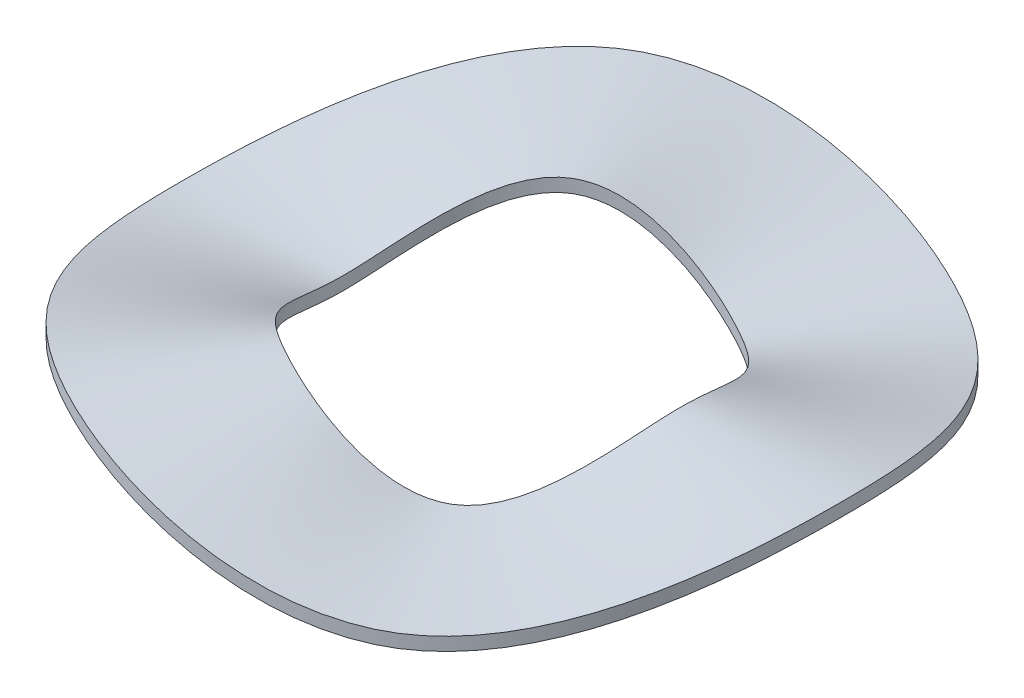
ISO-10303-21;
HEADER;
FILE_DESCRIPTION(('STEP AP214'),'2;1');
FILE_NAME('part.step','',(''),(''),'','','');
FILE_SCHEMA(('AUTOMOTIVE_DESIGN { 1 0 10303 214 1 1 1 1 }'));
ENDSEC;
DATA;
#1=APPLICATION_CONTEXT('core data for automotive mechanical design processes');
#2=APPLICATION_PROTOCOL_DEFINITION('international standard','automotive_design',2000,#1);
#3=PRODUCT_CONTEXT('',#1,'mechanical');
#4=PRODUCT('Part','Part','',(#3));
#5=PRODUCT_RELATED_PRODUCT_CATEGORY('part','',(#4));
#6=PRODUCT_DEFINITION_FORMATION('','',#4);
#7=PRODUCT_DEFINITION_CONTEXT('part definition',#1,'design');
#8=PRODUCT_DEFINITION('design','',#6,#7);
#9=PRODUCT_DEFINITION_SHAPE('','',#8);
#10=(LENGTH_UNIT() NAMED_UNIT(*) SI_UNIT(.MILLI.,.METRE.));
#11=(NAMED_UNIT(*) PLANE_ANGLE_UNIT() SI_UNIT($,.RADIAN.));
#12=(NAMED_UNIT(*) SI_UNIT($,.STERADIAN.) SOLID_ANGLE_UNIT());
#13=UNCERTAINTY_MEASURE_WITH_UNIT(LENGTH_MEASURE(1.E-05),#10,'distance_accuracy_value','');
#14=(GEOMETRIC_REPRESENTATION_CONTEXT(3) GLOBAL_UNCERTAINTY_ASSIGNED_CONTEXT((#13)) GLOBAL_UNIT_ASSIGNED_CONTEXT((#10,
#11,#12)) REPRESENTATION_CONTEXT('',''));
#15=CARTESIAN_POINT('',(0.,0.,0.));
#16=DIRECTION('',(0.,0.,1.));
#17=DIRECTION('',(1.,0.,0.));
#18=AXIS2_PLACEMENT_3D('',#15,#16,#17);
#19=CARTESIAN_POINT('',(-3.175,0.127,0.));
#20=CARTESIAN_POINT('',(-3.17500000000024,0.126999999999933,-0.0549926131404743));
#21=CARTESIAN_POINT('',(-3.17182500000067,0.129539999999809,-0.164977839421388));
#22=CARTESIAN_POINT('',(-3.15777562500116,0.140207999999649,-0.329543234244113));
#23=CARTESIAN_POINT('',(-3.13467750000151,0.156971999999514,-0.493283739869645));
#24=CARTESIAN_POINT('',(-2.94322500000291,0.289559999998846,-1.46830277084843));
#25=CARTESIAN_POINT('',(-1.65099999999217,1.0414000000012,-3.29955678841877));
#26=CARTESIAN_POINT('',(1.90499999998702,-0.380999999999987,-3.29955678842627));
#27=CARTESIAN_POINT('',(3.81000000000498,1.14299999999874,8.16995126065589E-12));
#28=CARTESIAN_POINT('',(1.90499999998431,-0.381000000001981,3.29955678842067));
#29=CARTESIAN_POINT('',(-1.65099999997634,1.04139999999984,3.2995567884332));
#30=CARTESIAN_POINT('',(-2.94322499999177,0.289560000001101,1.46830277084478));
#31=CARTESIAN_POINT('',(-3.13467749999722,0.156972000000686,0.493283739870457));
#32=CARTESIAN_POINT('',(-3.15777562499828,0.140208000000441,0.329543234244472));
#33=CARTESIAN_POINT('',(-3.17182499999923,0.129540000000208,0.164977839421458));
#34=CARTESIAN_POINT('',(-3.17499999999976,0.127000000000066,0.0549926131404746));
#35=CARTESIAN_POINT('',(-3.175,0.127,0.));
#36=CARTESIAN_POINT('',(-2.6543,0.127,0.));
#37=CARTESIAN_POINT('',(-2.6543000000002,0.126999999999933,-0.0459738245854365));
#38=CARTESIAN_POINT('',(-2.65164570000056,0.129539999999809,-0.137921473756281));
#39=CARTESIAN_POINT('',(-2.63990042250097,0.140207999999649,-0.275498143828078));
#40=CARTESIAN_POINT('',(-2.62059039000126,0.156971999999514,-0.412385206531023));
#41=CARTESIAN_POINT('',(-2.46053610000243,0.289559999998846,-1.22750111642929));
#42=CARTESIAN_POINT('',(-1.38023599999345,1.0414000000012,-2.7584294751181));
#43=CARTESIAN_POINT('',(1.59257999998915,-0.380999999999987,-2.75842947512436));
#44=CARTESIAN_POINT('',(3.18516000000417,1.14299999999874,6.82994852623138E-12));
#45=CARTESIAN_POINT('',(1.59257999998688,-0.381000000001981,2.75842947511968));
#46=CARTESIAN_POINT('',(-1.38023599998022,1.04139999999984,2.75842947513016));
#47=CARTESIAN_POINT('',(-2.46053609999312,0.289560000001101,1.22750111642624));
#48=CARTESIAN_POINT('',(-2.62059038999767,0.156972000000686,0.412385206531703));
#49=CARTESIAN_POINT('',(-2.63990042249856,0.140208000000441,0.275498143828379));
#50=CARTESIAN_POINT('',(-2.65164569999935,0.129540000000208,0.137921473756339));
#51=CARTESIAN_POINT('',(-2.6542999999998,0.127000000000066,0.0459738245854368));
#52=CARTESIAN_POINT('',(-2.6543,0.127,0.));
#53=CARTESIAN_POINT('',(-2.1336,0.127,0.));
#54=CARTESIAN_POINT('',(-2.13360000000016,0.126999999999933,-0.0369550360303987));
#55=CARTESIAN_POINT('',(-2.13146640000045,0.129539999999809,-0.110865108091173));
#56=CARTESIAN_POINT('',(-2.12202522000078,0.140207999999649,-0.221453053412044));
#57=CARTESIAN_POINT('',(-2.10650328000101,0.156971999999514,-0.331486673192401));
#58=CARTESIAN_POINT('',(-1.97784720000196,0.289559999998846,-0.986699462010148));
#59=CARTESIAN_POINT('',(-1.10947199999474,1.0414000000012,-2.21730216181742));
#60=CARTESIAN_POINT('',(1.28015999999128,-0.380999999999987,-2.21730216182246));
#61=CARTESIAN_POINT('',(2.56032000000335,1.14299999999874,5.49002371883801E-12));
#62=CARTESIAN_POINT('',(1.28015999998945,-0.381000000001981,2.21730216181869));
#63=CARTESIAN_POINT('',(-1.1094719999841,1.04139999999984,2.21730216182711));
#64=CARTESIAN_POINT('',(-1.97784719999447,0.289560000001101,0.986699462007693));
#65=CARTESIAN_POINT('',(-2.10650327999813,0.156972000000686,0.331486673192947));
#66=CARTESIAN_POINT('',(-2.12202521999885,0.140208000000441,0.221453053412285));
#67=CARTESIAN_POINT('',(-2.13146639999948,0.129540000000208,0.11086510809122));
#68=CARTESIAN_POINT('',(-2.13359999999984,0.127000000000066,0.036955036030399));
#69=CARTESIAN_POINT('',(-2.1336,0.127,0.));
#70=CARTESIAN_POINT('',(-1.6129,0.127,0.));
#71=CARTESIAN_POINT('',(-1.61290000000012,0.126999999999933,-0.027936247475361));
#72=CARTESIAN_POINT('',(-1.61128710000034,0.129539999999809,-0.0838087424260653));
#73=CARTESIAN_POINT('',(-1.60415001750059,0.140207999999649,-0.167407962996009));
#74=CARTESIAN_POINT('',(-1.59241617000077,0.156971999999514,-0.250588139853779));
#75=CARTESIAN_POINT('',(-1.49515830000148,0.289559999998846,-0.745897807591005));
#76=CARTESIAN_POINT('',(-0.838707999996021,1.0414000000012,-1.67617484851674));
#77=CARTESIAN_POINT('',(0.967739999993405,-0.380999999999987,-1.67617484852055));
#78=CARTESIAN_POINT('',(1.93548000000253,1.14299999999874,4.15046821780965E-12));
#79=CARTESIAN_POINT('',(0.967739999992027,-0.381000000001981,1.6761748485177));
#80=CARTESIAN_POINT('',(-0.838707999987978,1.04139999999984,1.67617484852407));
#81=CARTESIAN_POINT('',(-1.49515829999582,0.289560000001101,0.745897807589149));
#82=CARTESIAN_POINT('',(-1.59241616999859,0.156972000000686,0.250588139854192));
#83=CARTESIAN_POINT('',(-1.60415001749913,0.140208000000441,0.167407962996192));
#84=CARTESIAN_POINT('',(-1.61128709999961,0.129540000000208,0.0838087424261007));
#85=CARTESIAN_POINT('',(-1.61289999999988,0.127000000000066,0.0279362474753611));
#86=CARTESIAN_POINT('',(-1.6129,0.127,0.));
#87=B_SPLINE_SURFACE_WITH_KNOTS('',3,3,((#19,#20,#21,#22,#23,#24,#25,#26,#27,#28,#29,#30,#31,
#32,#33,#34,#35),(#36,#37,#38,#39,#40,#41,#42,#43,#44,#45,#46,#47,#48,#49,#50,#51,#52),(#53,#54,
#55,#56,#57,#58,#59,#60,#61,#62,#63,#64,#65,#66,#67,#68,#69),(#70,#71,#72,#73,#74,#75,#76,#77,
#78,#79,#80,#81,#82,#83,#84,#85,#86)),.UNSPECIFIED.,.F.,.T.,.F.,(4,4),(4,1,1,1,1,1,1,1,1,1,1,1,
1,1,4),(0.,1.),(0.,0.0083333333333333,0.0166666666666666,0.0250000000000001,0.0333333333333334,
0.16666666666667,0.333333333333885,0.5,0.666666666666687,0.833333333334569,0.966666666666667,
0.975,0.983333333333333,0.991666666666667,1.),.UNSPECIFIED.);
#88=CARTESIAN_POINT('',(-3.175,0.127,0.));
#89=CARTESIAN_POINT('',(-3.17500000000024,0.126999999999933,-0.0549926131404743));
#90=CARTESIAN_POINT('',(-3.17182500000067,0.129539999999809,-0.164977839421388));
#91=CARTESIAN_POINT('',(-3.15777562500116,0.140207999999649,-0.329543234244113));
#92=CARTESIAN_POINT('',(-3.13467750000151,0.156971999999514,-0.493283739869645));
#93=CARTESIAN_POINT('',(-2.94322500000291,0.289559999998846,-1.46830277084843));
#94=CARTESIAN_POINT('',(-1.65099999999217,1.0414000000012,-3.29955678841877));
#95=CARTESIAN_POINT('',(1.90499999998702,-0.380999999999987,-3.29955678842627));
#96=CARTESIAN_POINT('',(3.81000000000498,1.14299999999874,8.16995126065589E-12));
#97=CARTESIAN_POINT('',(1.90499999998431,-0.381000000001981,3.29955678842067));
#98=CARTESIAN_POINT('',(-1.65099999997634,1.04139999999984,3.2995567884332));
#99=CARTESIAN_POINT('',(-2.94322499999177,0.289560000001101,1.46830277084478));
#100=CARTESIAN_POINT('',(-3.13467749999722,0.156972000000686,0.493283739870457));
#101=CARTESIAN_POINT('',(-3.15777562499828,0.140208000000441,0.329543234244472));
#102=CARTESIAN_POINT('',(-3.17182499999923,0.129540000000208,0.164977839421458));
#103=CARTESIAN_POINT('',(-3.17499999999976,0.127000000000066,0.0549926131404746));
#104=CARTESIAN_POINT('',(-3.175,0.127,0.));
#105=B_SPLINE_CURVE_WITH_KNOTS('',3,(#88,#89,#90,#91,#92,#93,#94,#95,#96,#97,#98,#99,#100,#101,
#102,#103,#104),.UNSPECIFIED.,.T.,.F.,(4,1,1,1,1,1,1,1,1,1,1,1,1,1,4),(0.,0.0083333333333333,
0.0166666666666666,0.0250000000000001,0.0333333333333334,0.16666666666667,0.333333333333885,0.5,
0.666666666666687,0.833333333334569,0.966666666666667,0.975,0.983333333333333,0.991666666666667,
1.),.UNSPECIFIED.);
#106=CARTESIAN_POINT('',(-3.175,0.127,0.));
#107=VERTEX_POINT('',#106);
#108=EDGE_CURVE('E11',#107,#107,#105,.F.);
#109=CARTESIAN_POINT('',(-1.6129,0.127,0.));
#110=CARTESIAN_POINT('',(-1.61290000000012,0.126999999999933,-0.027936247475361));
#111=CARTESIAN_POINT('',(-1.61128710000034,0.129539999999809,-0.0838087424260653));
#112=CARTESIAN_POINT('',(-1.60415001750059,0.140207999999649,-0.167407962996009));
#113=CARTESIAN_POINT('',(-1.59241617000077,0.156971999999514,-0.250588139853779));
#114=CARTESIAN_POINT('',(-1.49515830000148,0.289559999998846,-0.745897807591005));
#115=CARTESIAN_POINT('',(-0.838707999996021,1.0414000000012,-1.67617484851674));
#116=CARTESIAN_POINT('',(0.967739999993405,-0.380999999999987,-1.67617484852055));
#117=CARTESIAN_POINT('',(1.93548000000253,1.14299999999874,4.15046821780965E-12));
#118=CARTESIAN_POINT('',(0.967739999992027,-0.381000000001981,1.6761748485177));
#119=CARTESIAN_POINT('',(-0.838707999987978,1.04139999999984,1.67617484852407));
#120=CARTESIAN_POINT('',(-1.49515829999582,0.289560000001101,0.745897807589149));
#121=CARTESIAN_POINT('',(-1.59241616999859,0.156972000000686,0.250588139854192));
#122=CARTESIAN_POINT('',(-1.60415001749913,0.140208000000441,0.167407962996192));
#123=CARTESIAN_POINT('',(-1.61128709999961,0.129540000000208,0.0838087424261007));
#124=CARTESIAN_POINT('',(-1.61289999999988,0.127000000000066,0.0279362474753611));
#125=CARTESIAN_POINT('',(-1.6129,0.127,0.));
#126=B_SPLINE_CURVE_WITH_KNOTS('',3,(#109,#110,#111,#112,#113,#114,#115,#116,#117,#118,#119,
#120,#121,#122,#123,#124,#125),.UNSPECIFIED.,.T.,.F.,(4,1,1,1,1,1,1,1,1,1,1,1,1,1,4),(0.,
0.0083333333333333,0.0166666666666666,0.0250000000000001,0.0333333333333334,0.16666666666667,
0.333333333333885,0.5,0.666666666666687,0.833333333334569,0.966666666666667,0.975,
0.983333333333333,0.991666666666667,1.),.UNSPECIFIED.);
#127=CARTESIAN_POINT('',(-1.6129,0.127,0.));
#128=VERTEX_POINT('',#127);
#129=EDGE_CURVE('E58',#128,#128,#126,.T.);
#130=ORIENTED_EDGE('',*,*,#108,.T.);
#131=EDGE_LOOP('',(#130));
#132=FACE_BOUND('',#131,.T.);
#133=ORIENTED_EDGE('',*,*,#129,.T.);
#134=EDGE_LOOP('',(#133));
#135=FACE_BOUND('',#134,.T.);
#136=ADVANCED_FACE('F46',(#132,#135),#87,.T.);
#137=CARTESIAN_POINT('',(-3.175,0.,0.));
#138=CARTESIAN_POINT('',(-3.17500000000024,0.,-0.0549926131404742));
#139=CARTESIAN_POINT('',(-3.17182500000067,0.00253999999980946,-0.164977839421388));
#140=CARTESIAN_POINT('',(-3.15777562500116,0.0132079999996492,-0.329543234244113));
#141=CARTESIAN_POINT('',(-3.13467750000151,0.0299719999995138,-0.493283739869645));
#142=CARTESIAN_POINT('',(-2.94322500000291,0.162559999998846,-1.46830277084843));
#143=CARTESIAN_POINT('',(-1.65099999999217,0.914400000001202,-3.29955678841877));
#144=CARTESIAN_POINT('',(1.90499999998702,-0.507999999999987,-3.29955678842627));
#145=CARTESIAN_POINT('',(3.81000000000498,1.01599999999874,8.16959889494984E-12));
#146=CARTESIAN_POINT('',(1.90499999998431,-0.508000000001981,3.29955678842067));
#147=CARTESIAN_POINT('',(-1.65099999997634,0.91439999999984,3.2995567884332));
#148=CARTESIAN_POINT('',(-2.94322499999177,0.162560000001101,1.46830277084478));
#149=CARTESIAN_POINT('',(-3.13467749999722,0.0299720000006862,0.493283739870458));
#150=CARTESIAN_POINT('',(-3.15777562499828,0.0132080000004409,0.329543234244472));
#151=CARTESIAN_POINT('',(-3.17182499999923,0.00254000000020836,0.164977839421458));
#152=CARTESIAN_POINT('',(-3.17499999999976,0.,0.0549926131404747));
#153=CARTESIAN_POINT('',(-3.175,0.,0.));
#154=CARTESIAN_POINT('',(-3.175,0.0105833333333332,0.));
#155=CARTESIAN_POINT('',(-3.17500000000024,0.0105833333332667,-0.0549926131404743));
#156=CARTESIAN_POINT('',(-3.17182500000067,0.0131233333331427,-0.164977839421388));
#157=CARTESIAN_POINT('',(-3.15777562500116,0.0237913333329824,-0.329543234244113));
#158=CARTESIAN_POINT('',(-3.13467750000151,0.040555333332847,-0.493283739869645));
#159=CARTESIAN_POINT('',(-2.94322500000291,0.173143333332179,-1.46830277084843));
#160=CARTESIAN_POINT('',(-1.65099999999217,0.924983333334535,-3.29955678841877));
#161=CARTESIAN_POINT('',(1.90499999998702,-0.497416666666654,-3.29955678842627));
#162=CARTESIAN_POINT('',(3.81000000000498,1.02658333333208,8.16995126065589E-12));
#163=CARTESIAN_POINT('',(1.90499999998431,-0.497416666668648,3.29955678842067));
#164=CARTESIAN_POINT('',(-1.65099999997634,0.924983333333173,3.2995567884332));
#165=CARTESIAN_POINT('',(-2.94322499999177,0.173143333334434,1.46830277084478));
#166=CARTESIAN_POINT('',(-3.13467749999722,0.0405553333340195,0.493283739870457));
#167=CARTESIAN_POINT('',(-3.15777562499828,0.0237913333337742,0.329543234244472));
#168=CARTESIAN_POINT('',(-3.17182499999923,0.0131233333335416,0.164977839421458));
#169=CARTESIAN_POINT('',(-3.17499999999976,0.0105833333333997,0.0549926131404746));
#170=CARTESIAN_POINT('',(-3.175,0.0105833333333332,0.));
#171=CARTESIAN_POINT('',(-3.17500000000001,0.0317500000000001,0.));
#172=CARTESIAN_POINT('',(-3.17500000000025,0.0317499999999336,-0.0549926131404742));
#173=CARTESIAN_POINT('',(-3.17182500000067,0.0342899999998095,-0.164977839421388));
#174=CARTESIAN_POINT('',(-3.15777562500116,0.0449579999996493,-0.329543234244113));
#175=CARTESIAN_POINT('',(-3.13467750000152,0.0617219999995139,-0.493283739869645));
#176=CARTESIAN_POINT('',(-2.94322500000291,0.194309999998846,-1.46830277084844));
#177=CARTESIAN_POINT('',(-1.65099999999217,0.946150000001203,-3.29955678841878));
#178=CARTESIAN_POINT('',(1.90499999998702,-0.476249999999988,-3.29955678842627));
#179=CARTESIAN_POINT('',(3.81000000000499,1.04774999999875,8.1674203262095E-12));
#180=CARTESIAN_POINT('',(1.9049999999843,-0.476250000001982,3.29955678842067));
#181=CARTESIAN_POINT('',(-1.65099999997633,0.946149999999841,3.2995567884332));
#182=CARTESIAN_POINT('',(-2.94322499999177,0.194310000001102,1.46830277084478));
#183=CARTESIAN_POINT('',(-3.13467749999722,0.0617220000006865,0.493283739870458));
#184=CARTESIAN_POINT('',(-3.15777562499829,0.0449580000004411,0.329543234244472));
#185=CARTESIAN_POINT('',(-3.17182499999923,0.0342900000002085,0.164977839421458));
#186=CARTESIAN_POINT('',(-3.17499999999977,0.0317500000000666,0.0549926131404747));
#187=CARTESIAN_POINT('',(-3.17500000000001,0.0317500000000001,0.));
#188=CARTESIAN_POINT('',(-3.175,0.0634999999999998,0.));
#189=CARTESIAN_POINT('',(-3.17500000000024,0.0634999999999333,-0.0549926131404742));
#190=CARTESIAN_POINT('',(-3.17182500000066,0.0660399999998093,-0.164977839421388));
#191=CARTESIAN_POINT('',(-3.15777562500115,0.076707999999649,-0.329543234244113));
#192=CARTESIAN_POINT('',(-3.13467750000151,0.0934719999995136,-0.493283739869644));
#193=CARTESIAN_POINT('',(-2.94322500000291,0.226059999998846,-1.46830277084843));
#194=CARTESIAN_POINT('',(-1.65099999999217,0.977900000001199,-3.29955678841877));
#195=CARTESIAN_POINT('',(1.90499999998702,-0.444499999999986,-3.29955678842628));
#196=CARTESIAN_POINT('',(3.81000000000498,1.07949999999874,8.17212982939623E-12));
#197=CARTESIAN_POINT('',(1.90499999998431,-0.44450000000198,3.29955678842066));
#198=CARTESIAN_POINT('',(-1.65099999997634,0.977899999999836,3.2995567884332));
#199=CARTESIAN_POINT('',(-2.94322499999177,0.2260600000011,1.46830277084478));
#200=CARTESIAN_POINT('',(-3.13467749999721,0.0934720000006859,0.493283739870458));
#201=CARTESIAN_POINT('',(-3.15777562499828,0.0767080000004407,0.329543234244472));
#202=CARTESIAN_POINT('',(-3.17182499999922,0.0660400000002082,0.164977839421458));
#203=CARTESIAN_POINT('',(-3.17499999999976,0.0635000000000663,0.0549926131404746));
#204=CARTESIAN_POINT('',(-3.175,0.0634999999999998,0.));
#205=CARTESIAN_POINT('',(-3.175,0.0952500000000001,0.));
#206=CARTESIAN_POINT('',(-3.17500000000024,0.0952499999999336,-0.0549926131404742));
#207=CARTESIAN_POINT('',(-3.17182500000067,0.0977899999998095,-0.164977839421388));
#208=CARTESIAN_POINT('',(-3.15777562500116,0.108457999999649,-0.329543234244113));
#209=CARTESIAN_POINT('',(-3.13467750000151,0.125221999999514,-0.493283739869645));
#210=CARTESIAN_POINT('',(-2.94322500000291,0.257809999998846,-1.46830277084844));
#211=CARTESIAN_POINT('',(-1.65099999999217,1.0096500000012,-3.29955678841878));
#212=CARTESIAN_POINT('',(1.90499999998702,-0.412749999999987,-3.29955678842627));
#213=CARTESIAN_POINT('',(3.81000000000499,1.11124999999875,8.16777608004735E-12));
#214=CARTESIAN_POINT('',(1.90499999998431,-0.412750000001982,3.29955678842067));
#215=CARTESIAN_POINT('',(-1.65099999997633,1.00964999999984,3.2995567884332));
#216=CARTESIAN_POINT('',(-2.94322499999177,0.257810000001102,1.46830277084478));
#217=CARTESIAN_POINT('',(-3.13467749999722,0.125222000000686,0.493283739870458));
#218=CARTESIAN_POINT('',(-3.15777562499829,0.108458000000441,0.329543234244472));
#219=CARTESIAN_POINT('',(-3.17182499999923,0.0977900000002085,0.164977839421458));
#220=CARTESIAN_POINT('',(-3.17499999999976,0.0952500000000666,0.0549926131404747));
#221=CARTESIAN_POINT('',(-3.175,0.0952500000000001,0.));
#222=CARTESIAN_POINT('',(-3.175,0.116416666666667,0.));
#223=CARTESIAN_POINT('',(-3.17500000000024,0.1164166666666,-0.0549926131404743));
#224=CARTESIAN_POINT('',(-3.17182500000067,0.118956666666476,-0.164977839421388));
#225=CARTESIAN_POINT('',(-3.15777562500116,0.129624666666316,-0.329543234244113));
#226=CARTESIAN_POINT('',(-3.13467750000151,0.14638866666618,-0.493283739869645));
#227=CARTESIAN_POINT('',(-2.94322500000291,0.278976666665513,-1.46830277084843));
#228=CARTESIAN_POINT('',(-1.65099999999217,1.03081666666787,-3.29955678841877));
#229=CARTESIAN_POINT('',(1.90499999998702,-0.39158333333332,-3.29955678842627));
#230=CARTESIAN_POINT('',(3.81000000000498,1.13241666666541,8.16995126065589E-12));
#231=CARTESIAN_POINT('',(1.90499999998431,-0.391583333335315,3.29955678842067));
#232=CARTESIAN_POINT('',(-1.65099999997634,1.03081666666651,3.2995567884332));
#233=CARTESIAN_POINT('',(-2.94322499999177,0.278976666667768,1.46830277084478));
#234=CARTESIAN_POINT('',(-3.13467749999722,0.146388666667353,0.493283739870457));
#235=CARTESIAN_POINT('',(-3.15777562499828,0.129624666667107,0.329543234244472));
#236=CARTESIAN_POINT('',(-3.17182499999923,0.118956666666875,0.164977839421458));
#237=CARTESIAN_POINT('',(-3.17499999999976,0.116416666666733,0.0549926131404746));
#238=CARTESIAN_POINT('',(-3.175,0.116416666666667,0.));
#239=CARTESIAN_POINT('',(-3.175,0.127,0.));
#240=CARTESIAN_POINT('',(-3.17500000000024,0.126999999999933,-0.0549926131404742));
#241=CARTESIAN_POINT('',(-3.17182500000067,0.129539999999809,-0.164977839421388));
#242=CARTESIAN_POINT('',(-3.15777562500116,0.140207999999649,-0.329543234244113));
#243=CARTESIAN_POINT('',(-3.13467750000151,0.156971999999514,-0.493283739869645));
#244=CARTESIAN_POINT('',(-2.94322500000291,0.289559999998846,-1.46830277084843));
#245=CARTESIAN_POINT('',(-1.65099999999217,1.0414000000012,-3.29955678841877));
#246=CARTESIAN_POINT('',(1.90499999998702,-0.380999999999987,-3.29955678842627));
#247=CARTESIAN_POINT('',(3.81000000000498,1.14299999999874,8.16959889494984E-12));
#248=CARTESIAN_POINT('',(1.90499999998431,-0.381000000001981,3.29955678842067));
#249=CARTESIAN_POINT('',(-1.65099999997634,1.04139999999984,3.2995567884332));
#250=CARTESIAN_POINT('',(-2.94322499999177,0.289560000001101,1.46830277084478));
#251=CARTESIAN_POINT('',(-3.13467749999722,0.156972000000686,0.493283739870458));
#252=CARTESIAN_POINT('',(-3.15777562499828,0.140208000000441,0.329543234244472));
#253=CARTESIAN_POINT('',(-3.17182499999923,0.129540000000208,0.164977839421458));
#254=CARTESIAN_POINT('',(-3.17499999999976,0.127000000000066,0.0549926131404747));
#255=CARTESIAN_POINT('',(-3.175,0.127,0.));
#256=B_SPLINE_SURFACE_WITH_KNOTS('',3,3,((#137,#138,#139,#140,#141,#142,#143,#144,#145,#146,
#147,#148,#149,#150,#151,#152,#153),(#154,#155,#156,#157,#158,#159,#160,#161,#162,#163,#164,
#165,#166,#167,#168,#169,#170),(#171,#172,#173,#174,#175,#176,#177,#178,#179,#180,#181,#182,
#183,#184,#185,#186,#187),(#188,#189,#190,#191,#192,#193,#194,#195,#196,#197,#198,#199,#200,
#201,#202,#203,#204),(#205,#206,#207,#208,#209,#210,#211,#212,#213,#214,#215,#216,#217,#218,
#219,#220,#221),(#222,#223,#224,#225,#226,#227,#228,#229,#230,#231,#232,#233,#234,#235,#236,
#237,#238),(#239,#240,#241,#242,#243,#244,#245,#246,#247,#248,#249,#250,#251,#252,#253,#254,
#255)),.UNSPECIFIED.,.F.,.T.,.F.,(4,1,1,1,4),(4,1,1,1,1,1,1,1,1,1,1,1,1,1,4),(0.93006993006993,
0.947552447552447,0.965034965034965,0.982517482517482,1.),(0.,0.0083333333333333,
0.0166666666666666,0.0250000000000001,0.0333333333333334,0.16666666666667,0.333333333333885,0.5,
0.666666666666687,0.833333333334569,0.966666666666667,0.975,0.983333333333333,0.991666666666667,
1.),.UNSPECIFIED.);
#257=CARTESIAN_POINT('',(-3.175,0.,0.));
#258=CARTESIAN_POINT('',(-3.17500000000024,0.,-0.0549926131404742));
#259=CARTESIAN_POINT('',(-3.17182500000067,0.00253999999980946,-0.164977839421388));
#260=CARTESIAN_POINT('',(-3.15777562500116,0.0132079999996492,-0.329543234244113));
#261=CARTESIAN_POINT('',(-3.13467750000151,0.0299719999995138,-0.493283739869645));
#262=CARTESIAN_POINT('',(-2.94322500000291,0.162559999998846,-1.46830277084843));
#263=CARTESIAN_POINT('',(-1.65099999999217,0.914400000001202,-3.29955678841877));
#264=CARTESIAN_POINT('',(1.90499999998702,-0.507999999999987,-3.29955678842627));
#265=CARTESIAN_POINT('',(3.81000000000498,1.01599999999874,8.16959889494984E-12));
#266=CARTESIAN_POINT('',(1.90499999998431,-0.508000000001981,3.29955678842067));
#267=CARTESIAN_POINT('',(-1.65099999997634,0.91439999999984,3.2995567884332));
#268=CARTESIAN_POINT('',(-2.94322499999177,0.162560000001101,1.46830277084478));
#269=CARTESIAN_POINT('',(-3.13467749999722,0.0299720000006862,0.493283739870458));
#270=CARTESIAN_POINT('',(-3.15777562499828,0.0132080000004409,0.329543234244472));
#271=CARTESIAN_POINT('',(-3.17182499999923,0.00254000000020836,0.164977839421458));
#272=CARTESIAN_POINT('',(-3.17499999999976,0.,0.0549926131404747));
#273=CARTESIAN_POINT('',(-3.175,0.,0.));
#274=B_SPLINE_CURVE_WITH_KNOTS('',3,(#257,#258,#259,#260,#261,#262,#263,#264,#265,#266,#267,
#268,#269,#270,#271,#272,#273),.UNSPECIFIED.,.T.,.F.,(4,1,1,1,1,1,1,1,1,1,1,1,1,1,4),(0.,
0.0083333333333333,0.0166666666666666,0.0250000000000001,0.0333333333333334,0.16666666666667,
0.333333333333885,0.5,0.666666666666687,0.833333333334569,0.966666666666667,0.975,
0.983333333333333,0.991666666666667,1.),.UNSPECIFIED.);
#275=CARTESIAN_POINT('',(-3.175,0.,0.));
#276=VERTEX_POINT('',#275);
#277=EDGE_CURVE('E52',#276,#276,#274,.T.);
#278=ORIENTED_EDGE('',*,*,#108,.F.);
#279=EDGE_LOOP('',(#278));
#280=FACE_BOUND('',#279,.T.);
#281=ORIENTED_EDGE('',*,*,#277,.F.);
#282=EDGE_LOOP('',(#281));
#283=FACE_BOUND('',#282,.T.);
#284=ADVANCED_FACE('F48',(#280,#283),#256,.T.);
#285=CARTESIAN_POINT('',(-1.6129,0.,0.));
#286=CARTESIAN_POINT('',(-1.61290000000012,0.,-0.027936247475361));
#287=CARTESIAN_POINT('',(-1.61128710000034,0.00253999999980946,-0.0838087424260653));
#288=CARTESIAN_POINT('',(-1.60415001750059,0.0132079999996492,-0.167407962996009));
#289=CARTESIAN_POINT('',(-1.59241617000077,0.0299719999995138,-0.250588139853779));
#290=CARTESIAN_POINT('',(-1.49515830000148,0.162559999998846,-0.745897807591005));
#291=CARTESIAN_POINT('',(-0.838707999996021,0.914400000001202,-1.67617484851674));
#292=CARTESIAN_POINT('',(0.967739999993405,-0.507999999999987,-1.67617484852055));
#293=CARTESIAN_POINT('',(1.93548000000253,1.01599999999874,4.15046821780965E-12));
#294=CARTESIAN_POINT('',(0.967739999992027,-0.508000000001981,1.6761748485177));
#295=CARTESIAN_POINT('',(-0.838707999987978,0.91439999999984,1.67617484852407));
#296=CARTESIAN_POINT('',(-1.49515829999582,0.162560000001101,0.745897807589149));
#297=CARTESIAN_POINT('',(-1.59241616999859,0.0299720000006862,0.250588139854192));
#298=CARTESIAN_POINT('',(-1.60415001749913,0.0132080000004409,0.167407962996192));
#299=CARTESIAN_POINT('',(-1.61128709999961,0.00254000000020836,0.0838087424261007));
#300=CARTESIAN_POINT('',(-1.61289999999988,0.,0.0279362474753611));
#301=CARTESIAN_POINT('',(-1.6129,0.,0.));
#302=CARTESIAN_POINT('',(-1.743075,0.,0.));
#303=CARTESIAN_POINT('',(-1.74307500000013,0.,-0.0301909446141203));
#304=CARTESIAN_POINT('',(-1.74133192500037,0.00253999999980946,-0.0905728338423421));
#305=CARTESIAN_POINT('',(-1.73361881812563,0.0132079999996492,-0.180919235600018));
#306=CARTESIAN_POINT('',(-1.72093794750083,0.0299719999995138,-0.270812773188435));
#307=CARTESIAN_POINT('',(-1.6158305250016,0.162559999998846,-0.80609822119579));
#308=CARTESIAN_POINT('',(-0.9063989999957,0.914400000001202,-1.81145667684191));
#309=CARTESIAN_POINT('',(1.04584499999287,-0.507999999999987,-1.81145667684602));
#310=CARTESIAN_POINT('',(2.09169000000274,1.01599999999874,4.48564254316997E-12));
#311=CARTESIAN_POINT('',(1.04584499999138,-0.508000000001981,1.81145667684295));
#312=CARTESIAN_POINT('',(-0.906398999987008,0.91439999999984,1.81145667684983));
#313=CARTESIAN_POINT('',(-1.61583052499548,0.162560000001101,0.806098221193785));
#314=CARTESIAN_POINT('',(-1.72093794749847,0.0299720000006862,0.270812773188881));
#315=CARTESIAN_POINT('',(-1.73361881812406,0.0132080000004409,0.180919235600215));
#316=CARTESIAN_POINT('',(-1.74133192499958,0.00254000000020836,0.0905728338423807));
#317=CARTESIAN_POINT('',(-1.74307499999987,0.,0.0301909446141206));
#318=CARTESIAN_POINT('',(-1.743075,0.,0.));
#319=CARTESIAN_POINT('',(-2.003425,0.,0.));
#320=CARTESIAN_POINT('',(-2.00342500000015,0.,-0.0347003388916393));
#321=CARTESIAN_POINT('',(-2.00142157500042,0.00253999999980946,-0.104101016674896));
#322=CARTESIAN_POINT('',(-1.99255641937573,0.0132079999996492,-0.207941780808036));
#323=CARTESIAN_POINT('',(-1.97798150250095,0.0299719999995138,-0.311262039857747));
#324=CARTESIAN_POINT('',(-1.85717497500184,0.162559999998846,-0.926499048405364));
#325=CARTESIAN_POINT('',(-1.04178099999506,0.914400000001203,-2.08202033349225));
#326=CARTESIAN_POINT('',(1.20205499999181,-0.507999999999988,-2.08202033349698));
#327=CARTESIAN_POINT('',(2.40411000000315,1.01599999999874,5.15504929325325E-12));
#328=CARTESIAN_POINT('',(1.2020549999901,-0.508000000001982,2.08202033349344));
#329=CARTESIAN_POINT('',(-1.04178099998507,0.914399999999841,2.08202033350135));
#330=CARTESIAN_POINT('',(-1.85717497499481,0.162560000001101,0.926499048403059));
#331=CARTESIAN_POINT('',(-1.97798150249825,0.0299720000006863,0.311262039858259));
#332=CARTESIAN_POINT('',(-1.99255641937392,0.013208000000441,0.207941780808262));
#333=CARTESIAN_POINT('',(-2.00142157499951,0.00254000000020837,0.10410101667494));
#334=CARTESIAN_POINT('',(-2.00342499999985,0.,0.0347003388916396));
#335=CARTESIAN_POINT('',(-2.003425,0.,0.));
#336=CARTESIAN_POINT('',(-2.39395,0.,0.));
#337=CARTESIAN_POINT('',(-2.39395000000018,0.,-0.0414644303079174));
#338=CARTESIAN_POINT('',(-2.3915560500005,0.00253999999980946,-0.124393290923727));
#339=CARTESIAN_POINT('',(-2.38096282125087,0.0132079999996492,-0.24847559862006));
#340=CARTESIAN_POINT('',(-2.36354683500114,0.0299719999995138,-0.371935939861711));
#341=CARTESIAN_POINT('',(-2.21919165000219,0.162559999998846,-1.10710028921972));
#342=CARTESIAN_POINT('',(-1.24485399999409,0.914400000001201,-2.48786581846775));
#343=CARTESIAN_POINT('',(1.43636999999021,-0.507999999999986,-2.48786581847341));
#344=CARTESIAN_POINT('',(2.87274000000376,1.01599999999874,6.16045368472158E-12));
#345=CARTESIAN_POINT('',(1.43636999998816,-0.508000000001981,2.48786581846918));
#346=CARTESIAN_POINT('',(-1.24485399998215,0.914399999999838,2.48786581847863));
#347=CARTESIAN_POINT('',(-2.21919164999379,0.162560000001101,1.10710028921696));
#348=CARTESIAN_POINT('',(-2.3635468349979,0.0299720000006862,0.371935939862325));
#349=CARTESIAN_POINT('',(-2.38096282124871,0.0132080000004409,0.248475598620332));
#350=CARTESIAN_POINT('',(-2.39155604999942,0.00254000000020835,0.124393290923779));
#351=CARTESIAN_POINT('',(-2.39394999999982,0.,0.0414644303079179));
#352=CARTESIAN_POINT('',(-2.39395,0.,0.));
#353=CARTESIAN_POINT('',(-2.784475,0.,0.));
#354=CARTESIAN_POINT('',(-2.78447500000021,0.,-0.0482285217241959));
#355=CARTESIAN_POINT('',(-2.78169052500058,0.00253999999980949,-0.144685565172558));
#356=CARTESIAN_POINT('',(-2.76936922312601,0.0132079999996493,-0.289009416432087));
#357=CARTESIAN_POINT('',(-2.74911216750132,0.0299719999995139,-0.432609839865679));
#358=CARTESIAN_POINT('',(-2.58120832500255,0.162559999998847,-1.28770153003408));
#359=CARTESIAN_POINT('',(-1.44792699999313,0.914400000001203,-2.89371130344327));
#360=CARTESIAN_POINT('',(1.67068499998862,-0.507999999999988,-2.89371130344984));
#361=CARTESIAN_POINT('',(3.34137000000437,1.01599999999874,7.16495344500225E-12));
#362=CARTESIAN_POINT('',(1.67068499998624,-0.508000000001982,2.89371130344493));
#363=CARTESIAN_POINT('',(-1.44792699997925,0.914399999999841,2.89371130345592));
#364=CARTESIAN_POINT('',(-2.58120832499278,0.162560000001101,1.28770153003087));
#365=CARTESIAN_POINT('',(-2.74911216749756,0.0299720000006863,0.432609839866391));
#366=CARTESIAN_POINT('',(-2.76936922312349,0.013208000000441,0.289009416432402));
#367=CARTESIAN_POINT('',(-2.78169052499932,0.00254000000020839,0.144685565172619));
#368=CARTESIAN_POINT('',(-2.78447499999979,0.,0.0482285217241963));
#369=CARTESIAN_POINT('',(-2.784475,0.,0.));
#370=CARTESIAN_POINT('',(-3.044825,0.,0.));
#371=CARTESIAN_POINT('',(-3.04482500000023,0.,-0.0527379160017148));
#372=CARTESIAN_POINT('',(-3.04178017500064,0.00253999999980946,-0.158213748005111));
#373=CARTESIAN_POINT('',(-3.02830682437611,0.0132079999996492,-0.316031961640104));
#374=CARTESIAN_POINT('',(-3.00615572250145,0.0299719999995138,-0.473059106534989));
#375=CARTESIAN_POINT('',(-2.82255277500279,0.162559999998846,-1.40810235724365));
#376=CARTESIAN_POINT('',(-1.58330899999249,0.914400000001202,-3.1642749600936));
#377=CARTESIAN_POINT('',(1.82689499998755,-0.507999999999987,-3.16427496010079));
#378=CARTESIAN_POINT('',(3.65379000000478,1.01599999999874,7.83449910848888E-12));
#379=CARTESIAN_POINT('',(1.82689499998495,-0.508000000001981,3.16427496009542));
#380=CARTESIAN_POINT('',(-1.58330899997731,0.91439999999984,3.16427496010744));
#381=CARTESIAN_POINT('',(-2.82255277499211,0.162560000001101,1.40810235724014));
#382=CARTESIAN_POINT('',(-3.00615572249733,0.0299720000006862,0.473059106535769));
#383=CARTESIAN_POINT('',(-3.02830682437336,0.0132080000004409,0.316031961640449));
#384=CARTESIAN_POINT('',(-3.04178017499926,0.00254000000020836,0.158213748005179));
#385=CARTESIAN_POINT('',(-3.04482499999977,0.,0.0527379160017152));
#386=CARTESIAN_POINT('',(-3.044825,0.,0.));
#387=CARTESIAN_POINT('',(-3.175,0.,0.));
#388=CARTESIAN_POINT('',(-3.17500000000024,0.,-0.0549926131404742));
#389=CARTESIAN_POINT('',(-3.17182500000067,0.00253999999980946,-0.164977839421388));
#390=CARTESIAN_POINT('',(-3.15777562500116,0.0132079999996492,-0.329543234244113));
#391=CARTESIAN_POINT('',(-3.13467750000151,0.0299719999995138,-0.493283739869645));
#392=CARTESIAN_POINT('',(-2.94322500000291,0.162559999998846,-1.46830277084843));
#393=CARTESIAN_POINT('',(-1.65099999999217,0.914400000001202,-3.29955678841877));
#394=CARTESIAN_POINT('',(1.90499999998702,-0.507999999999987,-3.29955678842627));
#395=CARTESIAN_POINT('',(3.81000000000498,1.01599999999874,8.16959889494984E-12));
#396=CARTESIAN_POINT('',(1.90499999998431,-0.508000000001981,3.29955678842067));
#397=CARTESIAN_POINT('',(-1.65099999997634,0.91439999999984,3.2995567884332));
#398=CARTESIAN_POINT('',(-2.94322499999177,0.162560000001101,1.46830277084478));
#399=CARTESIAN_POINT('',(-3.13467749999722,0.0299720000006862,0.493283739870458));
#400=CARTESIAN_POINT('',(-3.15777562499828,0.0132080000004409,0.329543234244472));
#401=CARTESIAN_POINT('',(-3.17182499999923,0.00254000000020836,0.164977839421458));
#402=CARTESIAN_POINT('',(-3.17499999999976,0.,0.0549926131404747));
#403=CARTESIAN_POINT('',(-3.175,0.,0.));
#404=B_SPLINE_SURFACE_WITH_KNOTS('',3,3,((#285,#286,#287,#288,#289,#290,#291,#292,#293,#294,
#295,#296,#297,#298,#299,#300,#301),(#302,#303,#304,#305,#306,#307,#308,#309,#310,#311,#312,
#313,#314,#315,#316,#317,#318),(#319,#320,#321,#322,#323,#324,#325,#326,#327,#328,#329,#330,
#331,#332,#333,#334,#335),(#336,#337,#338,#339,#340,#341,#342,#343,#344,#345,#346,#347,#348,
#349,#350,#351,#352),(#353,#354,#355,#356,#357,#358,#359,#360,#361,#362,#363,#364,#365,#366,
#367,#368,#369),(#370,#371,#372,#373,#374,#375,#376,#377,#378,#379,#380,#381,#382,#383,#384,
#385,#386),(#387,#388,#389,#390,#391,#392,#393,#394,#395,#396,#397,#398,#399,#400,#401,#402,
#403)),.UNSPECIFIED.,.F.,.T.,.F.,(4,1,1,1,4),(4,1,1,1,1,1,1,1,1,1,1,1,1,1,4),
(0.0699300699300699,0.284965034965035,0.5,0.715034965034965,0.93006993006993),(0.,
0.0083333333333333,0.0166666666666666,0.0250000000000001,0.0333333333333334,0.16666666666667,
0.333333333333885,0.5,0.666666666666687,0.833333333334569,0.966666666666667,0.975,
0.983333333333333,0.991666666666667,1.),.UNSPECIFIED.);
#405=CARTESIAN_POINT('',(-1.6129,0.,0.));
#406=CARTESIAN_POINT('',(-1.61290000000012,0.,-0.027936247475361));
#407=CARTESIAN_POINT('',(-1.61128710000034,0.00253999999980946,-0.0838087424260653));
#408=CARTESIAN_POINT('',(-1.60415001750059,0.0132079999996492,-0.167407962996009));
#409=CARTESIAN_POINT('',(-1.59241617000077,0.0299719999995138,-0.250588139853779));
#410=CARTESIAN_POINT('',(-1.49515830000148,0.162559999998846,-0.745897807591005));
#411=CARTESIAN_POINT('',(-0.838707999996021,0.914400000001202,-1.67617484851674));
#412=CARTESIAN_POINT('',(0.967739999993405,-0.507999999999987,-1.67617484852055));
#413=CARTESIAN_POINT('',(1.93548000000253,1.01599999999874,4.15046821780965E-12));
#414=CARTESIAN_POINT('',(0.967739999992027,-0.508000000001981,1.6761748485177));
#415=CARTESIAN_POINT('',(-0.838707999987978,0.91439999999984,1.67617484852407));
#416=CARTESIAN_POINT('',(-1.49515829999582,0.162560000001101,0.745897807589149));
#417=CARTESIAN_POINT('',(-1.59241616999859,0.0299720000006862,0.250588139854192));
#418=CARTESIAN_POINT('',(-1.60415001749913,0.0132080000004409,0.167407962996192));
#419=CARTESIAN_POINT('',(-1.61128709999961,0.00254000000020836,0.0838087424261007));
#420=CARTESIAN_POINT('',(-1.61289999999988,0.,0.0279362474753611));
#421=CARTESIAN_POINT('',(-1.6129,0.,0.));
#422=B_SPLINE_CURVE_WITH_KNOTS('',3,(#405,#406,#407,#408,#409,#410,#411,#412,#413,#414,#415,
#416,#417,#418,#419,#420,#421),.UNSPECIFIED.,.T.,.F.,(4,1,1,1,1,1,1,1,1,1,1,1,1,1,4),(0.,
0.0083333333333333,0.0166666666666666,0.0250000000000001,0.0333333333333334,0.16666666666667,
0.333333333333885,0.5,0.666666666666687,0.833333333334569,0.966666666666667,0.975,
0.983333333333333,0.991666666666667,1.),.UNSPECIFIED.);
#423=CARTESIAN_POINT('',(-1.6129,0.,0.));
#424=VERTEX_POINT('',#423);
#425=EDGE_CURVE('E71',#424,#424,#422,.T.);
#426=ORIENTED_EDGE('',*,*,#277,.T.);
#427=EDGE_LOOP('',(#426));
#428=FACE_BOUND('',#427,.T.);
#429=ORIENTED_EDGE('',*,*,#425,.F.);
#430=EDGE_LOOP('',(#429));
#431=FACE_BOUND('',#430,.T.);
#432=ADVANCED_FACE('F86',(#428,#431),#404,.T.);
#433=CARTESIAN_POINT('',(-1.6129,0.127,0.));
#434=CARTESIAN_POINT('',(-1.61290000000012,0.126999999999933,-0.027936247475361));
#435=CARTESIAN_POINT('',(-1.61128710000034,0.129539999999809,-0.0838087424260653));
#436=CARTESIAN_POINT('',(-1.60415001750059,0.140207999999649,-0.167407962996009));
#437=CARTESIAN_POINT('',(-1.59241617000077,0.156971999999514,-0.250588139853779));
#438=CARTESIAN_POINT('',(-1.49515830000148,0.289559999998846,-0.745897807591005));
#439=CARTESIAN_POINT('',(-0.838707999996021,1.0414000000012,-1.67617484851674));
#440=CARTESIAN_POINT('',(0.967739999993405,-0.380999999999987,-1.67617484852055));
#441=CARTESIAN_POINT('',(1.93548000000253,1.14299999999874,4.15046821780965E-12));
#442=CARTESIAN_POINT('',(0.967739999992027,-0.381000000001981,1.6761748485177));
#443=CARTESIAN_POINT('',(-0.838707999987978,1.04139999999984,1.67617484852407));
#444=CARTESIAN_POINT('',(-1.49515829999582,0.289560000001101,0.745897807589149));
#445=CARTESIAN_POINT('',(-1.59241616999859,0.156972000000686,0.250588139854192));
#446=CARTESIAN_POINT('',(-1.60415001749913,0.140208000000441,0.167407962996192));
#447=CARTESIAN_POINT('',(-1.61128709999961,0.129540000000208,0.0838087424261007));
#448=CARTESIAN_POINT('',(-1.61289999999988,0.127000000000066,0.0279362474753611));
#449=CARTESIAN_POINT('',(-1.6129,0.127,0.));
#450=CARTESIAN_POINT('',(-1.6129,0.116416666666667,0.));
#451=CARTESIAN_POINT('',(-1.61290000000012,0.1164166666666,-0.027936247475361));
#452=CARTESIAN_POINT('',(-1.61128710000034,0.118956666666476,-0.0838087424260653));
#453=CARTESIAN_POINT('',(-1.60415001750059,0.129624666666316,-0.167407962996009));
#454=CARTESIAN_POINT('',(-1.59241617000077,0.14638866666618,-0.250588139853779));
#455=CARTESIAN_POINT('',(-1.49515830000148,0.278976666665513,-0.745897807591005));
#456=CARTESIAN_POINT('',(-0.838707999996021,1.03081666666787,-1.67617484851674));
#457=CARTESIAN_POINT('',(0.967739999993405,-0.39158333333332,-1.67617484852055));
#458=CARTESIAN_POINT('',(1.93548000000253,1.13241666666541,4.15046144154607E-12));
#459=CARTESIAN_POINT('',(0.967739999992027,-0.391583333335315,1.6761748485177));
#460=CARTESIAN_POINT('',(-0.838707999987978,1.03081666666651,1.67617484852407));
#461=CARTESIAN_POINT('',(-1.49515829999582,0.278976666667768,0.745897807589149));
#462=CARTESIAN_POINT('',(-1.59241616999859,0.146388666667353,0.250588139854192));
#463=CARTESIAN_POINT('',(-1.60415001749913,0.129624666667108,0.167407962996192));
#464=CARTESIAN_POINT('',(-1.61128709999961,0.118956666666875,0.0838087424261007));
#465=CARTESIAN_POINT('',(-1.61289999999988,0.116416666666733,0.0279362474753611));
#466=CARTESIAN_POINT('',(-1.6129,0.116416666666667,0.));
#467=CARTESIAN_POINT('',(-1.6129,0.09525,0.));
#468=CARTESIAN_POINT('',(-1.61290000000012,0.0952499999999335,-0.027936247475361));
#469=CARTESIAN_POINT('',(-1.61128710000034,0.0977899999998095,-0.0838087424260654));
#470=CARTESIAN_POINT('',(-1.60415001750059,0.108457999999649,-0.167407962996009));
#471=CARTESIAN_POINT('',(-1.59241617000077,0.125221999999514,-0.25058813985378));
#472=CARTESIAN_POINT('',(-1.49515830000148,0.257809999998846,-0.745897807591005));
#473=CARTESIAN_POINT('',(-0.83870799999602,1.0096500000012,-1.67617484851674));
#474=CARTESIAN_POINT('',(0.967739999993405,-0.412749999999986,-1.67617484852055));
#475=CARTESIAN_POINT('',(1.93548000000253,1.11124999999874,4.15103403581842E-12));
#476=CARTESIAN_POINT('',(0.967739999992027,-0.41275000000198,1.6761748485177));
#477=CARTESIAN_POINT('',(-0.838707999987978,1.00964999999984,1.67617484852407));
#478=CARTESIAN_POINT('',(-1.49515829999582,0.257810000001101,0.74589780758915));
#479=CARTESIAN_POINT('',(-1.59241616999859,0.125222000000686,0.250588139854193));
#480=CARTESIAN_POINT('',(-1.60415001749913,0.108458000000441,0.167407962996192));
#481=CARTESIAN_POINT('',(-1.61128709999961,0.0977900000002084,0.0838087424261008));
#482=CARTESIAN_POINT('',(-1.61289999999988,0.0952500000000665,0.0279362474753611));
#483=CARTESIAN_POINT('',(-1.6129,0.09525,0.));
#484=CARTESIAN_POINT('',(-1.6129,0.0634999999999999,0.));
#485=CARTESIAN_POINT('',(-1.61290000000012,0.0634999999999335,-0.027936247475361));
#486=CARTESIAN_POINT('',(-1.61128710000034,0.0660399999998094,-0.0838087424260653));
#487=CARTESIAN_POINT('',(-1.60415001750059,0.0767079999996492,-0.167407962996009));
#488=CARTESIAN_POINT('',(-1.59241617000077,0.0934719999995138,-0.250588139853779));
#489=CARTESIAN_POINT('',(-1.49515830000148,0.226059999998846,-0.745897807591004));
#490=CARTESIAN_POINT('',(-0.838707999996022,0.977900000001203,-1.67617484851674));
#491=CARTESIAN_POINT('',(0.967739999993406,-0.444499999999988,-1.67617484852054));
#492=CARTESIAN_POINT('',(1.93548000000253,1.07949999999875,4.15025984770463E-12));
#493=CARTESIAN_POINT('',(0.967739999992029,-0.444500000001982,1.6761748485177));
#494=CARTESIAN_POINT('',(-0.83870799998798,0.977899999999841,1.67617484852406));
#495=CARTESIAN_POINT('',(-1.49515829999582,0.226060000001101,0.745897807589148));
#496=CARTESIAN_POINT('',(-1.59241616999859,0.0934720000006862,0.250588139854192));
#497=CARTESIAN_POINT('',(-1.60415001749913,0.0767080000004409,0.167407962996192));
#498=CARTESIAN_POINT('',(-1.61128709999961,0.0660400000002083,0.0838087424261007));
#499=CARTESIAN_POINT('',(-1.61289999999988,0.0635000000000664,0.027936247475361));
#500=CARTESIAN_POINT('',(-1.6129,0.0634999999999999,0.));
#501=CARTESIAN_POINT('',(-1.6129,0.03175,0.));
#502=CARTESIAN_POINT('',(-1.61290000000012,0.0317499999999335,-0.0279362474753609));
#503=CARTESIAN_POINT('',(-1.61128710000034,0.0342899999998095,-0.0838087424260652));
#504=CARTESIAN_POINT('',(-1.60415001750059,0.0449579999996492,-0.167407962996009));
#505=CARTESIAN_POINT('',(-1.59241617000077,0.0617219999995138,-0.250588139853779));
#506=CARTESIAN_POINT('',(-1.49515830000148,0.194309999998846,-0.745897807591004));
#507=CARTESIAN_POINT('',(-0.83870799999602,0.946150000001201,-1.67617484851674));
#508=CARTESIAN_POINT('',(0.967739999993404,-0.476249999999986,-1.67617484852055));
#509=CARTESIAN_POINT('',(1.93548000000253,1.04774999999874,4.1511915839466E-12));
#510=CARTESIAN_POINT('',(0.967739999992027,-0.476250000001981,1.6761748485177));
#511=CARTESIAN_POINT('',(-0.838707999987978,0.946149999999838,1.67617484852407));
#512=CARTESIAN_POINT('',(-1.49515829999582,0.194310000001101,0.745897807589149));
#513=CARTESIAN_POINT('',(-1.59241616999859,0.0617220000006861,0.250588139854193));
#514=CARTESIAN_POINT('',(-1.60415001749913,0.0449580000004409,0.167407962996192));
#515=CARTESIAN_POINT('',(-1.61128709999961,0.0342900000002083,0.0838087424261009));
#516=CARTESIAN_POINT('',(-1.61289999999988,0.0317500000000665,0.0279362474753612));
#517=CARTESIAN_POINT('',(-1.6129,0.03175,0.));
#518=CARTESIAN_POINT('',(-1.6129,0.0105833333333333,0.));
#519=CARTESIAN_POINT('',(-1.61290000000012,0.0105833333332668,-0.027936247475361));
#520=CARTESIAN_POINT('',(-1.61128710000034,0.0131233333331427,-0.0838087424260653));
#521=CARTESIAN_POINT('',(-1.60415001750059,0.0237913333329825,-0.167407962996009));
#522=CARTESIAN_POINT('',(-1.59241617000077,0.040555333332847,-0.250588139853779));
#523=CARTESIAN_POINT('',(-1.49515830000148,0.173143333332179,-0.745897807591005));
#524=CARTESIAN_POINT('',(-0.838707999996021,0.924983333334535,-1.67617484851674));
#525=CARTESIAN_POINT('',(0.967739999993405,-0.497416666666654,-1.67617484852055));
#526=CARTESIAN_POINT('',(1.93548000000253,1.02658333333208,4.15046144154607E-12));
#527=CARTESIAN_POINT('',(0.967739999992027,-0.497416666668648,1.6761748485177));
#528=CARTESIAN_POINT('',(-0.838707999987978,0.924983333333173,1.67617484852407));
#529=CARTESIAN_POINT('',(-1.49515829999582,0.173143333334434,0.745897807589149));
#530=CARTESIAN_POINT('',(-1.59241616999859,0.0405553333340195,0.250588139854192));
#531=CARTESIAN_POINT('',(-1.60415001749913,0.0237913333337742,0.167407962996192));
#532=CARTESIAN_POINT('',(-1.61128709999961,0.0131233333335416,0.0838087424261007));
#533=CARTESIAN_POINT('',(-1.61289999999988,0.0105833333333997,0.0279362474753611));
#534=CARTESIAN_POINT('',(-1.6129,0.0105833333333333,0.));
#535=CARTESIAN_POINT('',(-1.6129,0.,0.));
#536=CARTESIAN_POINT('',(-1.61290000000012,0.,-0.027936247475361));
#537=CARTESIAN_POINT('',(-1.61128710000034,0.00253999999980946,-0.0838087424260653));
#538=CARTESIAN_POINT('',(-1.60415001750059,0.0132079999996492,-0.167407962996009));
#539=CARTESIAN_POINT('',(-1.59241617000077,0.0299719999995138,-0.250588139853779));
#540=CARTESIAN_POINT('',(-1.49515830000148,0.162559999998846,-0.745897807591005));
#541=CARTESIAN_POINT('',(-0.838707999996021,0.914400000001202,-1.67617484851674));
#542=CARTESIAN_POINT('',(0.967739999993405,-0.507999999999987,-1.67617484852055));
#543=CARTESIAN_POINT('',(1.93548000000253,1.01599999999874,4.15046821780965E-12));
#544=CARTESIAN_POINT('',(0.967739999992027,-0.508000000001981,1.6761748485177));
#545=CARTESIAN_POINT('',(-0.838707999987978,0.91439999999984,1.67617484852407));
#546=CARTESIAN_POINT('',(-1.49515829999582,0.162560000001101,0.745897807589149));
#547=CARTESIAN_POINT('',(-1.59241616999859,0.0299720000006862,0.250588139854192));
#548=CARTESIAN_POINT('',(-1.60415001749913,0.0132080000004409,0.167407962996192));
#549=CARTESIAN_POINT('',(-1.61128709999961,0.00254000000020836,0.0838087424261007));
#550=CARTESIAN_POINT('',(-1.61289999999988,0.,0.0279362474753611));
#551=CARTESIAN_POINT('',(-1.6129,0.,0.));
#552=B_SPLINE_SURFACE_WITH_KNOTS('',3,3,((#433,#434,#435,#436,#437,#438,#439,#440,#441,#442,
#443,#444,#445,#446,#447,#448,#449),(#450,#451,#452,#453,#454,#455,#456,#457,#458,#459,#460,
#461,#462,#463,#464,#465,#466),(#467,#468,#469,#470,#471,#472,#473,#474,#475,#476,#477,#478,
#479,#480,#481,#482,#483),(#484,#485,#486,#487,#488,#489,#490,#491,#492,#493,#494,#495,#496,
#497,#498,#499,#500),(#501,#502,#503,#504,#505,#506,#507,#508,#509,#510,#511,#512,#513,#514,
#515,#516,#517),(#518,#519,#520,#521,#522,#523,#524,#525,#526,#527,#528,#529,#530,#531,#532,
#533,#534),(#535,#536,#537,#538,#539,#540,#541,#542,#543,#544,#545,#546,#547,#548,#549,#550,
#551)),.UNSPECIFIED.,.F.,.T.,.F.,(4,1,1,1,4),(4,1,1,1,1,1,1,1,1,1,1,1,1,1,4),(0.,
0.0174825174825175,0.034965034965035,0.0524475524475524,0.0699300699300699),(0.,
0.0083333333333333,0.0166666666666666,0.0250000000000001,0.0333333333333334,0.16666666666667,
0.333333333333885,0.5,0.666666666666687,0.833333333334569,0.966666666666667,0.975,
0.983333333333333,0.991666666666667,1.),.UNSPECIFIED.);
#553=ORIENTED_EDGE('',*,*,#425,.T.);
#554=EDGE_LOOP('',(#553));
#555=FACE_BOUND('',#554,.T.);
#556=ORIENTED_EDGE('',*,*,#129,.F.);
#557=EDGE_LOOP('',(#556));
#558=FACE_BOUND('',#557,.T.);
#559=ADVANCED_FACE('F95',(#555,#558),#552,.T.);
#560=CLOSED_SHELL('',(#136,#284,#432,#559));
#561=MANIFOLD_SOLID_BREP('B2',#560);
#562=ADVANCED_BREP_SHAPE_REPRESENTATION('',(#18,#561),#14);
#563=SHAPE_DEFINITION_REPRESENTATION(#9,#562);
ENDSEC;
END-ISO-10303-21;
